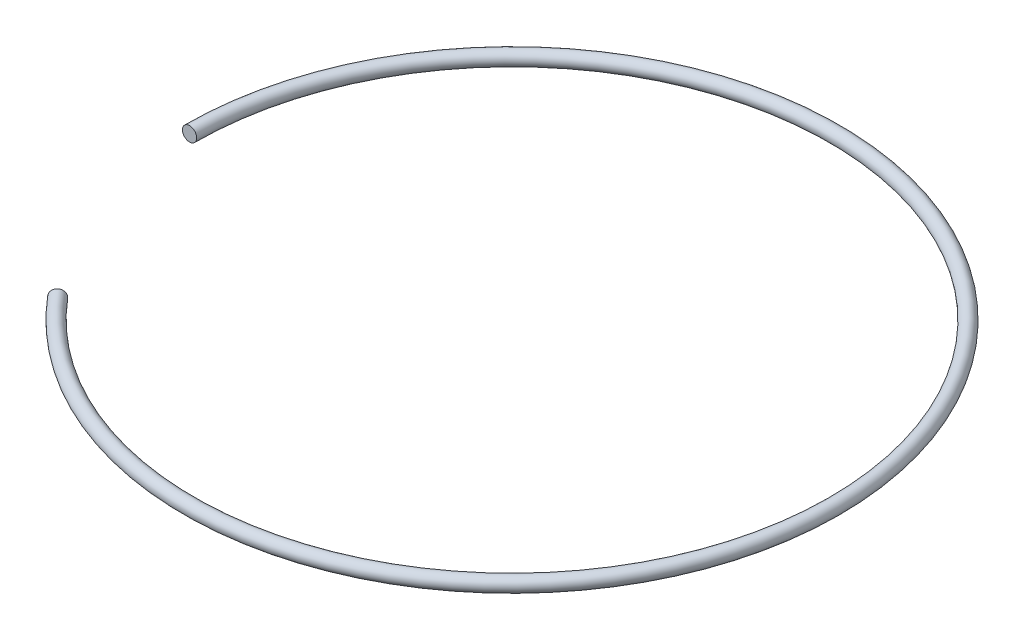
ISO-10303-21;
HEADER;
FILE_DESCRIPTION(('STEP AP214'),'2;1');
FILE_NAME('part.step','',(''),(''),'','','');
FILE_SCHEMA(('AUTOMOTIVE_DESIGN { 1 0 10303 214 1 1 1 1 }'));
ENDSEC;
DATA;
#1=APPLICATION_CONTEXT('core data for automotive mechanical design processes');
#2=APPLICATION_PROTOCOL_DEFINITION('international standard','automotive_design',2000,#1);
#3=PRODUCT_CONTEXT('',#1,'mechanical');
#4=PRODUCT('Part','Part','',(#3));
#5=PRODUCT_RELATED_PRODUCT_CATEGORY('part','',(#4));
#6=PRODUCT_DEFINITION_FORMATION('','',#4);
#7=PRODUCT_DEFINITION_CONTEXT('part definition',#1,'design');
#8=PRODUCT_DEFINITION('design','',#6,#7);
#9=PRODUCT_DEFINITION_SHAPE('','',#8);
#10=(LENGTH_UNIT() NAMED_UNIT(*) SI_UNIT(.MILLI.,.METRE.));
#11=(NAMED_UNIT(*) PLANE_ANGLE_UNIT() SI_UNIT($,.RADIAN.));
#12=(NAMED_UNIT(*) SI_UNIT($,.STERADIAN.) SOLID_ANGLE_UNIT());
#13=UNCERTAINTY_MEASURE_WITH_UNIT(LENGTH_MEASURE(1.E-05),#10,'distance_accuracy_value','');
#14=(GEOMETRIC_REPRESENTATION_CONTEXT(3) GLOBAL_UNCERTAINTY_ASSIGNED_CONTEXT((#13)) GLOBAL_UNIT_ASSIGNED_CONTEXT((#10,
#11,#12)) REPRESENTATION_CONTEXT('',''));
#15=CARTESIAN_POINT('',(0.,0.,0.));
#16=DIRECTION('',(0.,0.,1.));
#17=DIRECTION('',(1.,0.,0.));
#18=AXIS2_PLACEMENT_3D('',#15,#16,#17);
#19=CARTESIAN_POINT('',(-4.39740152128023,0.431800000000002,3.68985799464456));
#20=DIRECTION('',(0.64278760968653,0.,0.766044443118986));
#21=DIRECTION('',(0.766044443118986,0.,-0.64278760968653));
#22=AXIS2_PLACEMENT_3D('',#19,#20,#21);
#23=PLANE('',#22);
#24=CARTESIAN_POINT('',(-4.30011387700411,0.431800000000003,3.60822396821437));
#25=CARTESIAN_POINT('',(-4.30012110971447,0.446051737114623,3.60823003717896));
#26=CARTESIAN_POINT('',(-4.30197889704607,0.46035401031961,3.60978890584371));
#27=CARTESIAN_POINT('',(-4.30921730085306,0.487321409782773,3.61586264780847));
#28=CARTESIAN_POINT('',(-4.31459791732845,0.499986536040949,3.62037752110848));
#29=CARTESIAN_POINT('',(-4.32826700339893,0.522285438323943,3.63184724618874));
#30=CARTESIAN_POINT('',(-4.33655547299408,0.531919214348684,3.63880209796906));
#31=CARTESIAN_POINT('',(-4.35510804123239,0.547060252818037,3.65436955113522));
#32=CARTESIAN_POINT('',(-4.36537213987555,0.552567515262649,3.66298215252106));
#33=CARTESIAN_POINT('',(-4.3867181672782,0.558837043599968,3.68089359624173));
#34=CARTESIAN_POINT('',(-4.39780009603771,0.559599309492675,3.69019243857656));
#35=CARTESIAN_POINT('',(-4.41953254095189,0.556292256839856,3.70842812508862));
#36=CARTESIAN_POINT('',(-4.43018305710657,0.55222293829433,3.71736496926586));
#37=CARTESIAN_POINT('',(-4.44985186885108,0.539711675227261,3.73386906194638));
#38=CARTESIAN_POINT('',(-4.45887016444091,0.531269730705719,3.74143631044966));
#39=CARTESIAN_POINT('',(-4.4742578021803,0.510964934421827,3.75434807160147));
#40=CARTESIAN_POINT('',(-4.48062714432985,0.499102082659477,3.75969258425));
#41=CARTESIAN_POINT('',(-4.48999877706669,0.473292930660498,3.767556317823));
#42=CARTESIAN_POINT('',(-4.49300106765397,0.459346630423869,3.77007553874748));
#43=CARTESIAN_POINT('',(-4.49530011267919,0.430942918629512,3.7720046665802));
#44=CARTESIAN_POINT('',(-4.49459686711713,0.416485507071784,3.77141457348845));
#45=CARTESIAN_POINT('',(-4.48956412494912,0.388689533519734,3.76719160139146));
#46=CARTESIAN_POINT('',(-4.48523462834318,0.375350971525411,3.76355872238624));
#47=CARTESIAN_POINT('',(-4.47343750307323,0.35129653157986,3.75365975892327));
#48=CARTESIAN_POINT('',(-4.46596987440921,0.340580653628632,3.74739367446552));
#49=CARTESIAN_POINT('',(-4.44873839966034,0.322979667126574,3.73293475035911));
#50=CARTESIAN_POINT('',(-4.43897455357549,0.316094558575745,3.72474191071044));
#51=CARTESIAN_POINT('',(-4.4182514578668,0.306931536211358,3.70735316874442));
#52=CARTESIAN_POINT('',(-4.40729220824295,0.3046536223978,3.69815726642707));
#53=CARTESIAN_POINT('',(-4.38541382435628,0.304961129298173,3.67979912257701));
#54=CARTESIAN_POINT('',(-4.37449469009345,0.307546550012104,3.67063688104429));
#55=CARTESIAN_POINT('',(-4.35392778562843,0.317291768668017,3.65337919909324));
#56=CARTESIAN_POINT('',(-4.34428001542625,0.324451566609999,3.64528375867491));
#57=CARTESIAN_POINT('',(-4.32734280878232,0.342528887434404,3.63107175482681));
#58=CARTESIAN_POINT('',(-4.32005337234057,0.353446410316827,3.62495519139705));
#59=CARTESIAN_POINT('',(-4.30865743555836,0.377843541389768,3.61539286504617));
#60=CARTESIAN_POINT('',(-4.3045509352179,0.391323149580286,3.61194710212506));
#61=CARTESIAN_POINT('',(-4.30082974253776,0.413979928063893,3.60882465071962));
#62=CARTESIAN_POINT('',(-4.30010935016642,0.422880065760847,3.60822016974653));
#63=CARTESIAN_POINT('',(-4.30011387700411,0.431800000000003,3.60822396821437));
#64=B_SPLINE_CURVE_WITH_KNOTS('',3,(#24,#25,#26,#27,#28,#29,#30,#31,#32,#33,#34,#35,#36,#37,#38,
#39,#40,#41,#42,#43,#44,#45,#46,#47,#48,#49,#50,#51,#52,#53,#54,#55,#56,#57,#58,#59,#60,#61,#62,
#63),.UNSPECIFIED.,.T.,.F.,(4,2,2,2,2,2,2,2,2,2,2,2,2,2,2,2,2,2,2,4),(0.,0.0426429642402328,
0.0852859284804658,0.127928892721776,0.170571856963085,0.213214821204393,0.255857785445704,
0.298500749687014,0.341143713928323,0.383786678169632,0.426429642410941,0.46907260665225,
0.51171557089356,0.554358535134869,0.597001499376178,0.639644463617487,0.682287427858796,
0.724930392100106,0.767573356341415,0.79426290539262),.UNSPECIFIED.);
#65=CARTESIAN_POINT('',(-4.30011387700411,0.431800000000003,3.60822396821437));
#66=VERTEX_POINT('',#65);
#67=EDGE_CURVE('E19',#66,#66,#64,.T.);
#68=ORIENTED_EDGE('',*,*,#67,.F.);
#69=EDGE_LOOP('',(#68));
#70=FACE_BOUND('',#69,.T.);
#71=ADVANCED_FACE('F15',(#70),#23,.F.);
#72=CARTESIAN_POINT('',(-5.7404,0.431800000000002,0.));
#73=DIRECTION('',(0.,0.,1.));
#74=DIRECTION('',(1.,0.,0.));
#75=AXIS2_PLACEMENT_3D('',#72,#73,#74);
#76=PLANE('',#75);
#77=CARTESIAN_POINT('',(-5.6134,0.431800000000003,0.));
#78=CARTESIAN_POINT('',(-5.61340944163282,0.417548262885382,0.));
#79=CARTESIAN_POINT('',(-5.61583461075752,0.403245989680395,0.));
#80=CARTESIAN_POINT('',(-5.6252836758503,0.376278590217232,0.));
#81=CARTESIAN_POINT('',(-5.63230757181837,0.363613463959056,0.));
#82=CARTESIAN_POINT('',(-5.65015129641328,0.341314561676062,0.));
#83=CARTESIAN_POINT('',(-5.66097112504021,0.331680785651321,0.));
#84=CARTESIAN_POINT('',(-5.68518978285433,0.316539747181968,0.));
#85=CARTESIAN_POINT('',(-5.69858861204153,0.311032484737356,0.));
#86=CARTESIAN_POINT('',(-5.72645387181124,0.304762956400037,0.));
#87=CARTESIAN_POINT('',(-5.74092030239376,0.30400069050733,0.));
#88=CARTESIAN_POINT('',(-5.76928999439974,0.307307743160149,0.));
#89=CARTESIAN_POINT('',(-5.78319325582321,0.311377061705675,0.));
#90=CARTESIAN_POINT('',(-5.808869066047,0.323888324772744,0.));
#91=CARTESIAN_POINT('',(-5.82064161484732,0.332330269294286,0.));
#92=CARTESIAN_POINT('',(-5.84072874931793,0.352635065578177,0.));
#93=CARTESIAN_POINT('',(-5.8490433349882,0.364497917340527,0.));
#94=CARTESIAN_POINT('',(-5.86127713267581,0.390307069339506,0.));
#95=CARTESIAN_POINT('',(-5.86519634469315,0.404253369576136,0.));
#96=CARTESIAN_POINT('',(-5.86819753482757,0.432657081370493,0.));
#97=CARTESIAN_POINT('',(-5.86727951294466,0.447114492928221,0.));
#98=CARTESIAN_POINT('',(-5.86070973463322,0.474910466480271,0.));
#99=CARTESIAN_POINT('',(-5.85505797820469,0.488249028474593,0.));
#100=CARTESIAN_POINT('',(-5.83965792488412,0.512303468420144,0.));
#101=CARTESIAN_POINT('',(-5.82990962799209,0.523019346371373,0.));
#102=CARTESIAN_POINT('',(-5.80741553524897,0.540620332873431,0.));
#103=CARTESIAN_POINT('',(-5.79466973939789,0.54750544142426,0.));
#104=CARTESIAN_POINT('',(-5.76761765920223,0.556668463788648,0.));
#105=CARTESIAN_POINT('',(-5.75331137485765,0.558946377602205,0.));
#106=CARTESIAN_POINT('',(-5.72475117305317,0.558638870701832,0.));
#107=CARTESIAN_POINT('',(-5.71049725559327,0.556053449987901,0.));
#108=CARTESIAN_POINT('',(-5.68364906858565,0.546308231331987,0.));
#109=CARTESIAN_POINT('',(-5.67105479903792,0.539148433390005,0.));
#110=CARTESIAN_POINT('',(-5.648944846024,0.5210711125656,0.));
#111=CARTESIAN_POINT('',(-5.63942916255781,0.510153589683178,0.));
#112=CARTESIAN_POINT('',(-5.62455282361355,0.485756458610237,0.));
#113=CARTESIAN_POINT('',(-5.61919216813546,0.472276850419719,0.));
#114=CARTESIAN_POINT('',(-5.6143344960858,0.449620071936112,0.));
#115=CARTESIAN_POINT('',(-5.61339409063308,0.440719934239158,0.));
#116=CARTESIAN_POINT('',(-5.6134,0.431800000000003,0.));
#117=B_SPLINE_CURVE_WITH_KNOTS('',3,(#77,#78,#79,#80,#81,#82,#83,#84,#85,#86,#87,#88,#89,#90,
#91,#92,#93,#94,#95,#96,#97,#98,#99,#100,#101,#102,#103,#104,#105,#106,#107,#108,#109,#110,#111,
#112,#113,#114,#115,#116),.UNSPECIFIED.,.T.,.F.,(4,2,2,2,2,2,2,2,2,2,2,2,2,2,2,2,2,2,2,4),(0.,
0.042642964240233,0.085285928480466,0.127928892721775,0.170571856963085,0.213214821204392,
0.255857785445703,0.298500749687013,0.341143713928323,0.383786678169632,0.42642964241094,
0.46907260665225,0.51171557089356,0.554358535134869,0.59700149937618,0.639644463617489,
0.682287427858798,0.724930392100105,0.767573356341415,0.794262905392621),.UNSPECIFIED.);
#118=CARTESIAN_POINT('',(-5.6134,0.431800000000003,0.));
#119=VERTEX_POINT('',#118);
#120=EDGE_CURVE('E10',#119,#119,#117,.T.);
#121=ORIENTED_EDGE('',*,*,#120,.F.);
#122=EDGE_LOOP('',(#121));
#123=FACE_BOUND('',#122,.T.);
#124=ADVANCED_FACE('F37',(#123),#76,.T.);
#125=CARTESIAN_POINT('',(0.,0.431800000000002,0.));
#126=DIRECTION('',(0.,-1.,0.));
#127=DIRECTION('',(0.93969262078591,0.,-0.342020143325663));
#128=AXIS2_PLACEMENT_3D('',#125,#126,#127);
#129=TOROIDAL_SURFACE('',#128,5.7404,0.127000000000001);
#130=ORIENTED_EDGE('',*,*,#120,.T.);
#131=EDGE_LOOP('',(#130));
#132=FACE_BOUND('',#131,.T.);
#133=ORIENTED_EDGE('',*,*,#67,.T.);
#134=EDGE_LOOP('',(#133));
#135=FACE_BOUND('',#134,.T.);
#136=ADVANCED_FACE('F35',(#132,#135),#129,.T.);
#137=CLOSED_SHELL('',(#71,#124,#136));
#138=MANIFOLD_SOLID_BREP('B1',#137);
#139=ADVANCED_BREP_SHAPE_REPRESENTATION('',(#18,#138),#14);
#140=SHAPE_DEFINITION_REPRESENTATION(#9,#139);
ENDSEC;
END-ISO-10303-21;
